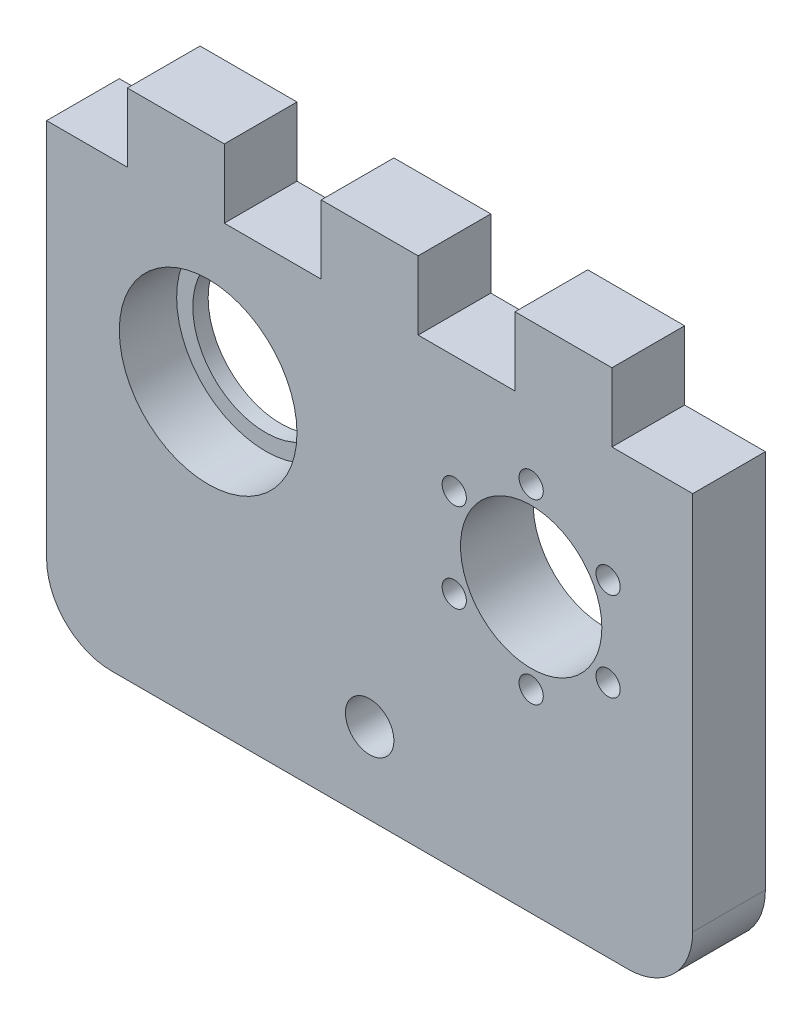
ISO-10303-21;
HEADER;
FILE_DESCRIPTION(('STEP AP214'),'2;1');
FILE_NAME('part.step','',(''),(''),'','','');
FILE_SCHEMA(('AUTOMOTIVE_DESIGN { 1 0 10303 214 1 1 1 1 }'));
ENDSEC;
DATA;
#1=APPLICATION_CONTEXT('core data for automotive mechanical design processes');
#2=APPLICATION_PROTOCOL_DEFINITION('international standard','automotive_design',2000,#1);
#3=PRODUCT_CONTEXT('',#1,'mechanical');
#4=PRODUCT('Part','Part','',(#3));
#5=PRODUCT_RELATED_PRODUCT_CATEGORY('part','',(#4));
#6=PRODUCT_DEFINITION_FORMATION('','',#4);
#7=PRODUCT_DEFINITION_CONTEXT('part definition',#1,'design');
#8=PRODUCT_DEFINITION('design','',#6,#7);
#9=PRODUCT_DEFINITION_SHAPE('','',#8);
#10=(LENGTH_UNIT() NAMED_UNIT(*) SI_UNIT(.MILLI.,.METRE.));
#11=(NAMED_UNIT(*) PLANE_ANGLE_UNIT() SI_UNIT($,.RADIAN.));
#12=(NAMED_UNIT(*) SI_UNIT($,.STERADIAN.) SOLID_ANGLE_UNIT());
#13=UNCERTAINTY_MEASURE_WITH_UNIT(LENGTH_MEASURE(1.E-05),#10,'distance_accuracy_value','');
#14=(GEOMETRIC_REPRESENTATION_CONTEXT(3) GLOBAL_UNCERTAINTY_ASSIGNED_CONTEXT((#13)) GLOBAL_UNIT_ASSIGNED_CONTEXT((#10,
#11,#12)) REPRESENTATION_CONTEXT('',''));
#15=CARTESIAN_POINT('',(0.,0.,0.));
#16=DIRECTION('',(0.,0.,1.));
#17=DIRECTION('',(1.,0.,0.));
#18=AXIS2_PLACEMENT_3D('',#15,#16,#17);
#19=CARTESIAN_POINT('',(0.,55.,9.));
#20=DIRECTION('',(0.,-1.,0.));
#21=DIRECTION('',(0.,0.,-1.));
#22=AXIS2_PLACEMENT_3D('',#19,#20,#21);
#23=PLANE('',#22);
#24=DIRECTION('',(-1.,0.,0.));
#25=VECTOR('',#24,1.);
#26=CARTESIAN_POINT('',(0.,55.,0.));
#27=LINE('',#26,#25);
#28=CARTESIAN_POINT('',(80.,55.,0.));
#29=VERTEX_POINT('',#28);
#30=CARTESIAN_POINT('',(70.,55.,0.));
#31=VERTEX_POINT('',#30);
#32=EDGE_CURVE('E314',#29,#31,#27,.T.);
#33=ORIENTED_EDGE('',*,*,#32,.T.);
#34=DIRECTION('',(0.,0.,1.));
#35=VECTOR('',#34,1.);
#36=CARTESIAN_POINT('',(70.,55.,0.));
#37=LINE('',#36,#35);
#38=CARTESIAN_POINT('',(70.,55.,9.));
#39=VERTEX_POINT('',#38);
#40=EDGE_CURVE('E56',#31,#39,#37,.T.);
#41=ORIENTED_EDGE('',*,*,#40,.T.);
#42=DIRECTION('',(-1.,0.,0.));
#43=VECTOR('',#42,1.);
#44=CARTESIAN_POINT('',(0.,55.,9.));
#45=LINE('',#44,#43);
#46=CARTESIAN_POINT('',(80.,55.,9.));
#47=VERTEX_POINT('',#46);
#48=EDGE_CURVE('E320',#47,#39,#45,.T.);
#49=ORIENTED_EDGE('',*,*,#48,.F.);
#50=DIRECTION('',(0.,0.,-1.));
#51=VECTOR('',#50,1.);
#52=CARTESIAN_POINT('',(80.,55.,9.));
#53=LINE('',#52,#51);
#54=EDGE_CURVE('E337',#47,#29,#53,.T.);
#55=ORIENTED_EDGE('',*,*,#54,.T.);
#56=EDGE_LOOP('',(#33,#41,#49,#55));
#57=FACE_BOUND('',#56,.T.);
#58=ADVANCED_FACE('F33',(#57),#23,.F.);
#59=CARTESIAN_POINT('',(9.99999999999999,55.,9.));
#60=VERTEX_POINT('',#59);
#61=CARTESIAN_POINT('',(0.,55.,9.));
#62=VERTEX_POINT('',#61);
#63=EDGE_CURVE('E319',#60,#62,#45,.T.);
#64=ORIENTED_EDGE('',*,*,#63,.F.);
#65=DIRECTION('',(0.,0.,1.));
#66=VECTOR('',#65,1.);
#67=CARTESIAN_POINT('',(9.99999999999999,55.,0.));
#68=LINE('',#67,#66);
#69=CARTESIAN_POINT('',(9.99999999999999,55.,0.));
#70=VERTEX_POINT('',#69);
#71=EDGE_CURVE('E216',#70,#60,#68,.T.);
#72=ORIENTED_EDGE('',*,*,#71,.F.);
#73=CARTESIAN_POINT('',(0.,55.,0.));
#74=VERTEX_POINT('',#73);
#75=EDGE_CURVE('E331',#70,#74,#27,.T.);
#76=ORIENTED_EDGE('',*,*,#75,.T.);
#77=DIRECTION('',(0.,0.,-1.));
#78=VECTOR('',#77,1.);
#79=CARTESIAN_POINT('',(0.,55.,9.));
#80=LINE('',#79,#78);
#81=EDGE_CURVE('E322',#62,#74,#80,.T.);
#82=ORIENTED_EDGE('',*,*,#81,.F.);
#83=EDGE_LOOP('',(#64,#72,#76,#82));
#84=FACE_BOUND('',#83,.T.);
#85=ADVANCED_FACE('F370',(#84),#23,.F.);
#86=CARTESIAN_POINT('',(34.,55.,0.));
#87=VERTEX_POINT('',#86);
#88=CARTESIAN_POINT('',(22.,55.,0.));
#89=VERTEX_POINT('',#88);
#90=EDGE_CURVE('E334',#87,#89,#27,.T.);
#91=ORIENTED_EDGE('',*,*,#90,.T.);
#92=DIRECTION('',(0.,0.,1.));
#93=VECTOR('',#92,1.);
#94=CARTESIAN_POINT('',(22.,55.,0.));
#95=LINE('',#94,#93);
#96=CARTESIAN_POINT('',(22.,55.,9.));
#97=VERTEX_POINT('',#96);
#98=EDGE_CURVE('E208',#89,#97,#95,.T.);
#99=ORIENTED_EDGE('',*,*,#98,.T.);
#100=CARTESIAN_POINT('',(34.,55.,9.));
#101=VERTEX_POINT('',#100);
#102=EDGE_CURVE('E323',#101,#97,#45,.T.);
#103=ORIENTED_EDGE('',*,*,#102,.F.);
#104=DIRECTION('',(0.,0.,1.));
#105=VECTOR('',#104,1.);
#106=CARTESIAN_POINT('',(34.,55.,0.));
#107=LINE('',#106,#105);
#108=EDGE_CURVE('E247',#87,#101,#107,.T.);
#109=ORIENTED_EDGE('',*,*,#108,.F.);
#110=EDGE_LOOP('',(#91,#99,#103,#109));
#111=FACE_BOUND('',#110,.T.);
#112=ADVANCED_FACE('F401',(#111),#23,.F.);
#113=CARTESIAN_POINT('',(0.,0.,9.));
#114=DIRECTION('',(1.,0.,0.));
#115=DIRECTION('',(0.,0.,-1.));
#116=AXIS2_PLACEMENT_3D('',#113,#114,#115);
#117=PLANE('',#116);
#118=DIRECTION('',(0.,-1.,0.));
#119=VECTOR('',#118,1.);
#120=CARTESIAN_POINT('',(0.,0.,0.));
#121=LINE('',#120,#119);
#122=CARTESIAN_POINT('',(0.,8.,0.));
#123=VERTEX_POINT('',#122);
#124=EDGE_CURVE('E309',#74,#123,#121,.T.);
#125=ORIENTED_EDGE('',*,*,#124,.T.);
#126=DIRECTION('',(0.,0.,-1.));
#127=VECTOR('',#126,1.);
#128=CARTESIAN_POINT('',(0.,8.,9.));
#129=LINE('',#128,#127);
#130=CARTESIAN_POINT('',(0.,8.,9.));
#131=VERTEX_POINT('',#130);
#132=EDGE_CURVE('E349',#123,#131,#129,.F.);
#133=ORIENTED_EDGE('',*,*,#132,.T.);
#134=DIRECTION('',(0.,-1.,0.));
#135=VECTOR('',#134,1.);
#136=CARTESIAN_POINT('',(0.,0.,9.));
#137=LINE('',#136,#135);
#138=EDGE_CURVE('E310',#62,#131,#137,.T.);
#139=ORIENTED_EDGE('',*,*,#138,.F.);
#140=ORIENTED_EDGE('',*,*,#81,.T.);
#141=EDGE_LOOP('',(#125,#133,#139,#140));
#142=FACE_BOUND('',#141,.T.);
#143=ADVANCED_FACE('F367',(#142),#117,.F.);
#144=CARTESIAN_POINT('',(0.,0.,9.));
#145=DIRECTION('',(0.,1.,0.));
#146=DIRECTION('',(0.,0.,1.));
#147=AXIS2_PLACEMENT_3D('',#144,#145,#146);
#148=PLANE('',#147);
#149=DIRECTION('',(1.,0.,0.));
#150=VECTOR('',#149,1.);
#151=CARTESIAN_POINT('',(0.,0.,9.));
#152=LINE('',#151,#150);
#153=CARTESIAN_POINT('',(8.,0.,9.));
#154=VERTEX_POINT('',#153);
#155=CARTESIAN_POINT('',(72.,0.,9.));
#156=VERTEX_POINT('',#155);
#157=EDGE_CURVE('E313',#154,#156,#152,.T.);
#158=ORIENTED_EDGE('',*,*,#157,.F.);
#159=DIRECTION('',(0.,0.,-1.));
#160=VECTOR('',#159,1.);
#161=CARTESIAN_POINT('',(8.,0.,9.));
#162=LINE('',#161,#160);
#163=CARTESIAN_POINT('',(8.,0.,0.));
#164=VERTEX_POINT('',#163);
#165=EDGE_CURVE('E342',#154,#164,#162,.T.);
#166=ORIENTED_EDGE('',*,*,#165,.T.);
#167=DIRECTION('',(1.,0.,0.));
#168=VECTOR('',#167,1.);
#169=CARTESIAN_POINT('',(0.,0.,0.));
#170=LINE('',#169,#168);
#171=CARTESIAN_POINT('',(72.,0.,0.));
#172=VERTEX_POINT('',#171);
#173=EDGE_CURVE('E326',#164,#172,#170,.T.);
#174=ORIENTED_EDGE('',*,*,#173,.T.);
#175=DIRECTION('',(0.,0.,-1.));
#176=VECTOR('',#175,1.);
#177=CARTESIAN_POINT('',(72.,0.,9.));
#178=LINE('',#177,#176);
#179=EDGE_CURVE('E340',#172,#156,#178,.F.);
#180=ORIENTED_EDGE('',*,*,#179,.T.);
#181=EDGE_LOOP('',(#158,#166,#174,#180));
#182=FACE_BOUND('',#181,.T.);
#183=ADVANCED_FACE('F362',(#182),#148,.F.);
#184=CARTESIAN_POINT('',(80.,0.,9.));
#185=DIRECTION('',(-1.,0.,0.));
#186=DIRECTION('',(0.,0.,1.));
#187=AXIS2_PLACEMENT_3D('',#184,#185,#186);
#188=PLANE('',#187);
#189=DIRECTION('',(0.,1.,0.));
#190=VECTOR('',#189,1.);
#191=CARTESIAN_POINT('',(80.,0.,9.));
#192=LINE('',#191,#190);
#193=CARTESIAN_POINT('',(80.,8.,9.));
#194=VERTEX_POINT('',#193);
#195=EDGE_CURVE('E317',#194,#47,#192,.T.);
#196=ORIENTED_EDGE('',*,*,#195,.F.);
#197=DIRECTION('',(0.,0.,-1.));
#198=VECTOR('',#197,1.);
#199=CARTESIAN_POINT('',(80.,8.,9.));
#200=LINE('',#199,#198);
#201=CARTESIAN_POINT('',(80.,8.,0.));
#202=VERTEX_POINT('',#201);
#203=EDGE_CURVE('E11',#194,#202,#200,.T.);
#204=ORIENTED_EDGE('',*,*,#203,.T.);
#205=DIRECTION('',(0.,1.,0.));
#206=VECTOR('',#205,1.);
#207=CARTESIAN_POINT('',(80.,0.,0.));
#208=LINE('',#207,#206);
#209=EDGE_CURVE('E329',#202,#29,#208,.T.);
#210=ORIENTED_EDGE('',*,*,#209,.T.);
#211=ORIENTED_EDGE('',*,*,#54,.F.);
#212=EDGE_LOOP('',(#196,#204,#210,#211));
#213=FACE_BOUND('',#212,.T.);
#214=ADVANCED_FACE('F423',(#213),#188,.F.);
#215=CARTESIAN_POINT('',(58.,55.,9.));
#216=VERTEX_POINT('',#215);
#217=CARTESIAN_POINT('',(46.,55.,9.));
#218=VERTEX_POINT('',#217);
#219=EDGE_CURVE('E48',#216,#218,#45,.T.);
#220=ORIENTED_EDGE('',*,*,#219,.F.);
#221=DIRECTION('',(0.,0.,1.));
#222=VECTOR('',#221,1.);
#223=CARTESIAN_POINT('',(58.,55.,0.));
#224=LINE('',#223,#222);
#225=CARTESIAN_POINT('',(58.,55.,0.));
#226=VERTEX_POINT('',#225);
#227=EDGE_CURVE('E195',#226,#216,#224,.T.);
#228=ORIENTED_EDGE('',*,*,#227,.F.);
#229=CARTESIAN_POINT('',(46.,55.,0.));
#230=VERTEX_POINT('',#229);
#231=EDGE_CURVE('E333',#226,#230,#27,.T.);
#232=ORIENTED_EDGE('',*,*,#231,.T.);
#233=DIRECTION('',(0.,0.,1.));
#234=VECTOR('',#233,1.);
#235=CARTESIAN_POINT('',(46.,55.,0.));
#236=LINE('',#235,#234);
#237=EDGE_CURVE('E245',#230,#218,#236,.T.);
#238=ORIENTED_EDGE('',*,*,#237,.T.);
#239=EDGE_LOOP('',(#220,#228,#232,#238));
#240=FACE_BOUND('',#239,.T.);
#241=ADVANCED_FACE('F374',(#240),#23,.F.);
#242=CARTESIAN_POINT('',(0.,0.,9.));
#243=DIRECTION('',(0.,0.,-1.));
#244=DIRECTION('',(-1.,0.,0.));
#245=AXIS2_PLACEMENT_3D('',#242,#243,#244);
#246=PLANE('',#245);
#247=CARTESIAN_POINT('',(40.,10.,9.));
#248=DIRECTION('',(0.,0.,1.));
#249=DIRECTION('',(1.,0.,0.));
#250=AXIS2_PLACEMENT_3D('',#247,#248,#249);
#251=CIRCLE('',#250,3.00000000000001);
#252=CARTESIAN_POINT('',(43.,10.,9.));
#253=VERTEX_POINT('',#252);
#254=EDGE_CURVE('E258',#253,#253,#251,.T.);
#255=ORIENTED_EDGE('',*,*,#254,.F.);
#256=EDGE_LOOP('',(#255));
#257=FACE_BOUND('',#256,.T.);
#258=CARTESIAN_POINT('',(50.4737205583712,40.5,9.));
#259=DIRECTION('',(0.,0.,1.));
#260=DIRECTION('',(1.,0.,0.));
#261=AXIS2_PLACEMENT_3D('',#258,#259,#260);
#262=CIRCLE('',#261,1.5);
#263=CARTESIAN_POINT('',(51.9737205583712,40.5,9.));
#264=VERTEX_POINT('',#263);
#265=EDGE_CURVE('E262',#264,#264,#262,.T.);
#266=ORIENTED_EDGE('',*,*,#265,.F.);
#267=EDGE_LOOP('',(#266));
#268=FACE_BOUND('',#267,.T.);
#269=CARTESIAN_POINT('',(50.4737205583712,29.5,9.));
#270=DIRECTION('',(0.,0.,1.));
#271=DIRECTION('',(1.,0.,0.));
#272=AXIS2_PLACEMENT_3D('',#269,#270,#271);
#273=CIRCLE('',#272,1.5);
#274=CARTESIAN_POINT('',(51.9737205583712,29.5,9.));
#275=VERTEX_POINT('',#274);
#276=EDGE_CURVE('E281',#275,#275,#273,.T.);
#277=ORIENTED_EDGE('',*,*,#276,.F.);
#278=EDGE_LOOP('',(#277));
#279=FACE_BOUND('',#278,.T.);
#280=CARTESIAN_POINT('',(60.,24.,9.));
#281=DIRECTION('',(0.,0.,1.));
#282=DIRECTION('',(1.,0.,0.));
#283=AXIS2_PLACEMENT_3D('',#280,#281,#282);
#284=CIRCLE('',#283,1.5);
#285=CARTESIAN_POINT('',(61.5,24.,9.));
#286=VERTEX_POINT('',#285);
#287=EDGE_CURVE('E275',#286,#286,#284,.T.);
#288=ORIENTED_EDGE('',*,*,#287,.F.);
#289=EDGE_LOOP('',(#288));
#290=FACE_BOUND('',#289,.T.);
#291=CARTESIAN_POINT('',(69.5262794416288,29.5,9.));
#292=DIRECTION('',(0.,0.,1.));
#293=DIRECTION('',(1.,0.,0.));
#294=AXIS2_PLACEMENT_3D('',#291,#292,#293);
#295=CIRCLE('',#294,1.5);
#296=CARTESIAN_POINT('',(71.0262794416288,29.5,9.));
#297=VERTEX_POINT('',#296);
#298=EDGE_CURVE('E269',#297,#297,#295,.T.);
#299=ORIENTED_EDGE('',*,*,#298,.F.);
#300=EDGE_LOOP('',(#299));
#301=FACE_BOUND('',#300,.T.);
#302=CARTESIAN_POINT('',(60.,35.,9.));
#303=DIRECTION('',(0.,0.,1.));
#304=DIRECTION('',(1.,0.,0.));
#305=AXIS2_PLACEMENT_3D('',#302,#303,#304);
#306=CIRCLE('',#305,8.75000000000001);
#307=CARTESIAN_POINT('',(68.75,35.,9.));
#308=VERTEX_POINT('',#307);
#309=EDGE_CURVE('E292',#308,#308,#306,.T.);
#310=ORIENTED_EDGE('',*,*,#309,.F.);
#311=EDGE_LOOP('',(#310));
#312=FACE_BOUND('',#311,.T.);
#313=CARTESIAN_POINT('',(60.,46.,9.));
#314=DIRECTION('',(0.,0.,1.));
#315=DIRECTION('',(1.,0.,0.));
#316=AXIS2_PLACEMENT_3D('',#313,#314,#315);
#317=CIRCLE('',#316,1.5);
#318=CARTESIAN_POINT('',(61.5,46.,9.));
#319=VERTEX_POINT('',#318);
#320=EDGE_CURVE('E293',#319,#319,#317,.T.);
#321=ORIENTED_EDGE('',*,*,#320,.F.);
#322=EDGE_LOOP('',(#321));
#323=FACE_BOUND('',#322,.T.);
#324=CARTESIAN_POINT('',(69.5262794416288,40.5,9.));
#325=DIRECTION('',(0.,0.,1.));
#326=DIRECTION('',(1.,0.,0.));
#327=AXIS2_PLACEMENT_3D('',#324,#325,#326);
#328=CIRCLE('',#327,1.5);
#329=CARTESIAN_POINT('',(71.0262794416288,40.5,9.));
#330=VERTEX_POINT('',#329);
#331=EDGE_CURVE('E268',#330,#330,#328,.T.);
#332=ORIENTED_EDGE('',*,*,#331,.F.);
#333=EDGE_LOOP('',(#332));
#334=FACE_BOUND('',#333,.T.);
#335=CARTESIAN_POINT('',(20.,37.,9.));
#336=DIRECTION('',(0.,0.,1.));
#337=DIRECTION('',(1.,0.,0.));
#338=AXIS2_PLACEMENT_3D('',#335,#336,#337);
#339=CIRCLE('',#338,11.);
#340=CARTESIAN_POINT('',(31.,37.,9.));
#341=VERTEX_POINT('',#340);
#342=EDGE_CURVE('E304',#341,#341,#339,.T.);
#343=ORIENTED_EDGE('',*,*,#342,.F.);
#344=EDGE_LOOP('',(#343));
#345=FACE_BOUND('',#344,.T.);
#346=ORIENTED_EDGE('',*,*,#138,.T.);
#347=CARTESIAN_POINT('',(8.,8.,9.));
#348=DIRECTION('',(0.,0.,-1.));
#349=DIRECTION('',(-1.,0.,0.));
#350=AXIS2_PLACEMENT_3D('',#347,#348,#349);
#351=CIRCLE('',#350,8.);
#352=EDGE_CURVE('E41',#131,#154,#351,.F.);
#353=ORIENTED_EDGE('',*,*,#352,.T.);
#354=ORIENTED_EDGE('',*,*,#157,.T.);
#355=CARTESIAN_POINT('',(72.,8.,9.));
#356=DIRECTION('',(0.,0.,-1.));
#357=DIRECTION('',(-1.,0.,0.));
#358=AXIS2_PLACEMENT_3D('',#355,#356,#357);
#359=CIRCLE('',#358,8.);
#360=EDGE_CURVE('E351',#156,#194,#359,.F.);
#361=ORIENTED_EDGE('',*,*,#360,.T.);
#362=ORIENTED_EDGE('',*,*,#195,.T.);
#363=ORIENTED_EDGE('',*,*,#48,.T.);
#364=DIRECTION('',(0.,1.,0.));
#365=VECTOR('',#364,1.);
#366=CARTESIAN_POINT('',(70.,55.,9.));
#367=LINE('',#366,#365);
#368=CARTESIAN_POINT('',(70.,63.5,9.));
#369=VERTEX_POINT('',#368);
#370=EDGE_CURVE('E190',#39,#369,#367,.T.);
#371=ORIENTED_EDGE('',*,*,#370,.T.);
#372=DIRECTION('',(-1.,0.,0.));
#373=VECTOR('',#372,1.);
#374=CARTESIAN_POINT('',(58.,63.5,9.));
#375=LINE('',#374,#373);
#376=CARTESIAN_POINT('',(58.,63.5,9.));
#377=VERTEX_POINT('',#376);
#378=EDGE_CURVE('E165',#369,#377,#375,.T.);
#379=ORIENTED_EDGE('',*,*,#378,.T.);
#380=DIRECTION('',(0.,-1.,0.));
#381=VECTOR('',#380,1.);
#382=CARTESIAN_POINT('',(58.,55.,9.));
#383=LINE('',#382,#381);
#384=EDGE_CURVE('E184',#377,#216,#383,.T.);
#385=ORIENTED_EDGE('',*,*,#384,.T.);
#386=ORIENTED_EDGE('',*,*,#219,.T.);
#387=DIRECTION('',(0.,1.,0.));
#388=VECTOR('',#387,1.);
#389=CARTESIAN_POINT('',(46.,55.,9.));
#390=LINE('',#389,#388);
#391=CARTESIAN_POINT('',(46.,63.5,9.));
#392=VERTEX_POINT('',#391);
#393=EDGE_CURVE('E229',#218,#392,#390,.T.);
#394=ORIENTED_EDGE('',*,*,#393,.T.);
#395=DIRECTION('',(-1.,0.,0.));
#396=VECTOR('',#395,1.);
#397=CARTESIAN_POINT('',(34.,63.5,9.));
#398=LINE('',#397,#396);
#399=CARTESIAN_POINT('',(34.,63.5,9.));
#400=VERTEX_POINT('',#399);
#401=EDGE_CURVE('E219',#392,#400,#398,.T.);
#402=ORIENTED_EDGE('',*,*,#401,.T.);
#403=DIRECTION('',(0.,-1.,0.));
#404=VECTOR('',#403,1.);
#405=CARTESIAN_POINT('',(34.,55.,9.));
#406=LINE('',#405,#404);
#407=EDGE_CURVE('E237',#400,#101,#406,.T.);
#408=ORIENTED_EDGE('',*,*,#407,.T.);
#409=ORIENTED_EDGE('',*,*,#102,.T.);
#410=DIRECTION('',(0.,1.,0.));
#411=VECTOR('',#410,1.);
#412=CARTESIAN_POINT('',(22.,55.,9.));
#413=LINE('',#412,#411);
#414=CARTESIAN_POINT('',(22.,63.5,9.));
#415=VERTEX_POINT('',#414);
#416=EDGE_CURVE('E194',#97,#415,#413,.T.);
#417=ORIENTED_EDGE('',*,*,#416,.T.);
#418=DIRECTION('',(-1.,0.,0.));
#419=VECTOR('',#418,1.);
#420=CARTESIAN_POINT('',(22.,63.5,9.));
#421=LINE('',#420,#419);
#422=CARTESIAN_POINT('',(9.99999999999999,63.5,9.));
#423=VERTEX_POINT('',#422);
#424=EDGE_CURVE('E211',#415,#423,#421,.T.);
#425=ORIENTED_EDGE('',*,*,#424,.T.);
#426=DIRECTION('',(0.,-1.,0.));
#427=VECTOR('',#426,1.);
#428=CARTESIAN_POINT('',(9.99999999999999,55.,9.));
#429=LINE('',#428,#427);
#430=EDGE_CURVE('E202',#423,#60,#429,.T.);
#431=ORIENTED_EDGE('',*,*,#430,.T.);
#432=ORIENTED_EDGE('',*,*,#63,.T.);
#433=EDGE_LOOP('',(#346,#353,#354,#361,#362,#363,#371,#379,#385,#386,#394,#402,#408,#409,#417,
#425,#431,#432));
#434=FACE_BOUND('',#433,.T.);
#435=ADVANCED_FACE('F355',(#257,#268,#279,#290,#301,#312,#323,#334,#345,#434),#246,.F.);
#436=CARTESIAN_POINT('',(0.,0.,0.));
#437=DIRECTION('',(0.,0.,-1.));
#438=DIRECTION('',(-1.,0.,0.));
#439=AXIS2_PLACEMENT_3D('',#436,#437,#438);
#440=PLANE('',#439);
#441=CARTESIAN_POINT('',(40.,10.,0.));
#442=DIRECTION('',(0.,0.,1.));
#443=DIRECTION('',(1.,0.,0.));
#444=AXIS2_PLACEMENT_3D('',#441,#442,#443);
#445=CIRCLE('',#444,3.00000000000001);
#446=CARTESIAN_POINT('',(43.,10.,0.));
#447=VERTEX_POINT('',#446);
#448=EDGE_CURVE('E259',#447,#447,#445,.T.);
#449=ORIENTED_EDGE('',*,*,#448,.T.);
#450=EDGE_LOOP('',(#449));
#451=FACE_BOUND('',#450,.T.);
#452=CARTESIAN_POINT('',(50.4737205583712,40.5,0.));
#453=DIRECTION('',(0.,0.,1.));
#454=DIRECTION('',(1.,0.,0.));
#455=AXIS2_PLACEMENT_3D('',#452,#453,#454);
#456=CIRCLE('',#455,1.5);
#457=CARTESIAN_POINT('',(51.9737205583712,40.5,0.));
#458=VERTEX_POINT('',#457);
#459=EDGE_CURVE('E284',#458,#458,#456,.T.);
#460=ORIENTED_EDGE('',*,*,#459,.T.);
#461=EDGE_LOOP('',(#460));
#462=FACE_BOUND('',#461,.T.);
#463=CARTESIAN_POINT('',(50.4737205583712,29.5,0.));
#464=DIRECTION('',(0.,0.,1.));
#465=DIRECTION('',(1.,0.,0.));
#466=AXIS2_PLACEMENT_3D('',#463,#464,#465);
#467=CIRCLE('',#466,1.5);
#468=CARTESIAN_POINT('',(51.9737205583712,29.5,0.));
#469=VERTEX_POINT('',#468);
#470=EDGE_CURVE('E278',#469,#469,#467,.T.);
#471=ORIENTED_EDGE('',*,*,#470,.T.);
#472=EDGE_LOOP('',(#471));
#473=FACE_BOUND('',#472,.T.);
#474=CARTESIAN_POINT('',(60.,24.,0.));
#475=DIRECTION('',(0.,0.,1.));
#476=DIRECTION('',(1.,0.,0.));
#477=AXIS2_PLACEMENT_3D('',#474,#475,#476);
#478=CIRCLE('',#477,1.5);
#479=CARTESIAN_POINT('',(61.5,24.,0.));
#480=VERTEX_POINT('',#479);
#481=EDGE_CURVE('E272',#480,#480,#478,.T.);
#482=ORIENTED_EDGE('',*,*,#481,.T.);
#483=EDGE_LOOP('',(#482));
#484=FACE_BOUND('',#483,.T.);
#485=CARTESIAN_POINT('',(69.5262794416288,29.5,0.));
#486=DIRECTION('',(0.,0.,1.));
#487=DIRECTION('',(1.,0.,0.));
#488=AXIS2_PLACEMENT_3D('',#485,#486,#487);
#489=CIRCLE('',#488,1.5);
#490=CARTESIAN_POINT('',(71.0262794416288,29.5,0.));
#491=VERTEX_POINT('',#490);
#492=EDGE_CURVE('E265',#491,#491,#489,.T.);
#493=ORIENTED_EDGE('',*,*,#492,.T.);
#494=EDGE_LOOP('',(#493));
#495=FACE_BOUND('',#494,.T.);
#496=CARTESIAN_POINT('',(60.,35.,0.));
#497=DIRECTION('',(0.,0.,1.));
#498=DIRECTION('',(1.,0.,0.));
#499=AXIS2_PLACEMENT_3D('',#496,#497,#498);
#500=CIRCLE('',#499,8.75000000000001);
#501=CARTESIAN_POINT('',(68.75,35.,0.));
#502=VERTEX_POINT('',#501);
#503=EDGE_CURVE('E301',#502,#502,#500,.T.);
#504=ORIENTED_EDGE('',*,*,#503,.T.);
#505=EDGE_LOOP('',(#504));
#506=FACE_BOUND('',#505,.T.);
#507=CARTESIAN_POINT('',(60.,46.,0.));
#508=DIRECTION('',(0.,0.,1.));
#509=DIRECTION('',(1.,0.,0.));
#510=AXIS2_PLACEMENT_3D('',#507,#508,#509);
#511=CIRCLE('',#510,1.5);
#512=CARTESIAN_POINT('',(61.5,46.,0.));
#513=VERTEX_POINT('',#512);
#514=EDGE_CURVE('E289',#513,#513,#511,.T.);
#515=ORIENTED_EDGE('',*,*,#514,.T.);
#516=EDGE_LOOP('',(#515));
#517=FACE_BOUND('',#516,.T.);
#518=CARTESIAN_POINT('',(69.5262794416288,40.5,0.));
#519=DIRECTION('',(0.,0.,1.));
#520=DIRECTION('',(1.,0.,0.));
#521=AXIS2_PLACEMENT_3D('',#518,#519,#520);
#522=CIRCLE('',#521,1.5);
#523=CARTESIAN_POINT('',(71.0262794416288,40.5,0.));
#524=VERTEX_POINT('',#523);
#525=EDGE_CURVE('E296',#524,#524,#522,.T.);
#526=ORIENTED_EDGE('',*,*,#525,.T.);
#527=EDGE_LOOP('',(#526));
#528=FACE_BOUND('',#527,.T.);
#529=ORIENTED_EDGE('',*,*,#173,.F.);
#530=CARTESIAN_POINT('',(8.,8.,0.));
#531=DIRECTION('',(0.,0.,-1.));
#532=DIRECTION('',(-1.,0.,0.));
#533=AXIS2_PLACEMENT_3D('',#530,#531,#532);
#534=CIRCLE('',#533,8.);
#535=EDGE_CURVE('E347',#164,#123,#534,.T.);
#536=ORIENTED_EDGE('',*,*,#535,.T.);
#537=ORIENTED_EDGE('',*,*,#124,.F.);
#538=ORIENTED_EDGE('',*,*,#75,.F.);
#539=DIRECTION('',(0.,-1.,0.));
#540=VECTOR('',#539,1.);
#541=CARTESIAN_POINT('',(9.99999999999999,55.,0.));
#542=LINE('',#541,#540);
#543=CARTESIAN_POINT('',(9.99999999999999,63.5,0.));
#544=VERTEX_POINT('',#543);
#545=EDGE_CURVE('E205',#544,#70,#542,.T.);
#546=ORIENTED_EDGE('',*,*,#545,.F.);
#547=DIRECTION('',(-1.,0.,0.));
#548=VECTOR('',#547,1.);
#549=CARTESIAN_POINT('',(22.,63.5,0.));
#550=LINE('',#549,#548);
#551=CARTESIAN_POINT('',(22.,63.5,0.));
#552=VERTEX_POINT('',#551);
#553=EDGE_CURVE('E201',#552,#544,#550,.T.);
#554=ORIENTED_EDGE('',*,*,#553,.F.);
#555=DIRECTION('',(0.,1.,0.));
#556=VECTOR('',#555,1.);
#557=CARTESIAN_POINT('',(22.,55.,0.));
#558=LINE('',#557,#556);
#559=EDGE_CURVE('E198',#89,#552,#558,.T.);
#560=ORIENTED_EDGE('',*,*,#559,.F.);
#561=ORIENTED_EDGE('',*,*,#90,.F.);
#562=DIRECTION('',(0.,-1.,0.));
#563=VECTOR('',#562,1.);
#564=CARTESIAN_POINT('',(34.,55.,0.));
#565=LINE('',#564,#563);
#566=CARTESIAN_POINT('',(34.,63.5,0.));
#567=VERTEX_POINT('',#566);
#568=EDGE_CURVE('E228',#567,#87,#565,.T.);
#569=ORIENTED_EDGE('',*,*,#568,.F.);
#570=DIRECTION('',(-1.,0.,0.));
#571=VECTOR('',#570,1.);
#572=CARTESIAN_POINT('',(34.,63.5,0.));
#573=LINE('',#572,#571);
#574=CARTESIAN_POINT('',(46.,63.5,0.));
#575=VERTEX_POINT('',#574);
#576=EDGE_CURVE('E225',#575,#567,#573,.T.);
#577=ORIENTED_EDGE('',*,*,#576,.F.);
#578=DIRECTION('',(0.,1.,0.));
#579=VECTOR('',#578,1.);
#580=CARTESIAN_POINT('',(46.,55.,0.));
#581=LINE('',#580,#579);
#582=EDGE_CURVE('E231',#230,#575,#581,.T.);
#583=ORIENTED_EDGE('',*,*,#582,.F.);
#584=ORIENTED_EDGE('',*,*,#231,.F.);
#585=DIRECTION('',(0.,-1.,0.));
#586=VECTOR('',#585,1.);
#587=CARTESIAN_POINT('',(58.,55.,0.));
#588=LINE('',#587,#586);
#589=CARTESIAN_POINT('',(58.,63.5,0.));
#590=VERTEX_POINT('',#589);
#591=EDGE_CURVE('E171',#590,#226,#588,.T.);
#592=ORIENTED_EDGE('',*,*,#591,.F.);
#593=DIRECTION('',(-1.,0.,0.));
#594=VECTOR('',#593,1.);
#595=CARTESIAN_POINT('',(58.,63.5,0.));
#596=LINE('',#595,#594);
#597=CARTESIAN_POINT('',(70.,63.5,0.));
#598=VERTEX_POINT('',#597);
#599=EDGE_CURVE('E163',#598,#590,#596,.T.);
#600=ORIENTED_EDGE('',*,*,#599,.F.);
#601=DIRECTION('',(0.,1.,0.));
#602=VECTOR('',#601,1.);
#603=CARTESIAN_POINT('',(70.,55.,0.));
#604=LINE('',#603,#602);
#605=EDGE_CURVE('E180',#31,#598,#604,.T.);
#606=ORIENTED_EDGE('',*,*,#605,.F.);
#607=ORIENTED_EDGE('',*,*,#32,.F.);
#608=ORIENTED_EDGE('',*,*,#209,.F.);
#609=CARTESIAN_POINT('',(72.,8.,0.));
#610=DIRECTION('',(0.,0.,-1.));
#611=DIRECTION('',(-1.,0.,0.));
#612=AXIS2_PLACEMENT_3D('',#609,#610,#611);
#613=CIRCLE('',#612,8.);
#614=EDGE_CURVE('E345',#202,#172,#613,.T.);
#615=ORIENTED_EDGE('',*,*,#614,.T.);
#616=EDGE_LOOP('',(#529,#536,#537,#538,#546,#554,#560,#561,#569,#577,#583,#584,#592,#600,#606,
#607,#608,#615));
#617=FACE_BOUND('',#616,.T.);
#618=CARTESIAN_POINT('',(20.,37.,0.));
#619=DIRECTION('',(0.,0.,1.));
#620=DIRECTION('',(1.,0.,0.));
#621=AXIS2_PLACEMENT_3D('',#618,#619,#620);
#622=CIRCLE('',#621,9.);
#623=CARTESIAN_POINT('',(11.,37.,0.));
#624=VERTEX_POINT('',#623);
#625=EDGE_CURVE('E244',#624,#624,#622,.T.);
#626=ORIENTED_EDGE('',*,*,#625,.T.);
#627=EDGE_LOOP('',(#626));
#628=FACE_BOUND('',#627,.T.);
#629=ADVANCED_FACE('F177',(#451,#462,#473,#484,#495,#506,#517,#528,#617,#628),#440,.T.);
#630=CARTESIAN_POINT('',(20.,37.,0.));
#631=DIRECTION('',(0.,0.,1.));
#632=DIRECTION('',(1.,0.,0.));
#633=AXIS2_PLACEMENT_3D('',#630,#631,#632);
#634=CYLINDRICAL_SURFACE('',#633,11.);
#635=CARTESIAN_POINT('',(20.,37.,1.9));
#636=DIRECTION('',(0.,0.,1.));
#637=DIRECTION('',(1.,0.,0.));
#638=AXIS2_PLACEMENT_3D('',#635,#636,#637);
#639=CIRCLE('',#638,11.);
#640=CARTESIAN_POINT('',(31.,37.,1.9));
#641=VERTEX_POINT('',#640);
#642=EDGE_CURVE('E253',#641,#641,#639,.T.);
#643=ORIENTED_EDGE('',*,*,#642,.F.);
#644=EDGE_LOOP('',(#643));
#645=FACE_BOUND('',#644,.T.);
#646=ORIENTED_EDGE('',*,*,#342,.T.);
#647=EDGE_LOOP('',(#646));
#648=FACE_BOUND('',#647,.T.);
#649=ADVANCED_FACE('F481',(#645,#648),#634,.F.);
#650=CARTESIAN_POINT('',(69.5262794416288,40.5,0.));
#651=DIRECTION('',(0.,0.,1.));
#652=DIRECTION('',(1.,0.,0.));
#653=AXIS2_PLACEMENT_3D('',#650,#651,#652);
#654=CYLINDRICAL_SURFACE('',#653,1.5);
#655=ORIENTED_EDGE('',*,*,#525,.F.);
#656=EDGE_LOOP('',(#655));
#657=FACE_BOUND('',#656,.T.);
#658=ORIENTED_EDGE('',*,*,#331,.T.);
#659=EDGE_LOOP('',(#658));
#660=FACE_BOUND('',#659,.T.);
#661=ADVANCED_FACE('F477',(#657,#660),#654,.F.);
#662=CARTESIAN_POINT('',(60.,46.,0.));
#663=DIRECTION('',(0.,0.,1.));
#664=DIRECTION('',(1.,0.,0.));
#665=AXIS2_PLACEMENT_3D('',#662,#663,#664);
#666=CYLINDRICAL_SURFACE('',#665,1.5);
#667=ORIENTED_EDGE('',*,*,#514,.F.);
#668=EDGE_LOOP('',(#667));
#669=FACE_BOUND('',#668,.T.);
#670=ORIENTED_EDGE('',*,*,#320,.T.);
#671=EDGE_LOOP('',(#670));
#672=FACE_BOUND('',#671,.T.);
#673=ADVANCED_FACE('F474',(#669,#672),#666,.F.);
#674=CARTESIAN_POINT('',(60.,35.,0.));
#675=DIRECTION('',(0.,0.,1.));
#676=DIRECTION('',(1.,0.,0.));
#677=AXIS2_PLACEMENT_3D('',#674,#675,#676);
#678=CYLINDRICAL_SURFACE('',#677,8.75000000000001);
#679=ORIENTED_EDGE('',*,*,#503,.F.);
#680=EDGE_LOOP('',(#679));
#681=FACE_BOUND('',#680,.T.);
#682=ORIENTED_EDGE('',*,*,#309,.T.);
#683=EDGE_LOOP('',(#682));
#684=FACE_BOUND('',#683,.T.);
#685=ADVANCED_FACE('F466',(#681,#684),#678,.F.);
#686=CARTESIAN_POINT('',(69.5262794416288,29.5,0.));
#687=DIRECTION('',(0.,0.,1.));
#688=DIRECTION('',(1.,0.,0.));
#689=AXIS2_PLACEMENT_3D('',#686,#687,#688);
#690=CYLINDRICAL_SURFACE('',#689,1.5);
#691=ORIENTED_EDGE('',*,*,#492,.F.);
#692=EDGE_LOOP('',(#691));
#693=FACE_BOUND('',#692,.T.);
#694=ORIENTED_EDGE('',*,*,#298,.T.);
#695=EDGE_LOOP('',(#694));
#696=FACE_BOUND('',#695,.T.);
#697=ADVANCED_FACE('F462',(#693,#696),#690,.F.);
#698=CARTESIAN_POINT('',(60.,24.,0.));
#699=DIRECTION('',(0.,0.,1.));
#700=DIRECTION('',(1.,0.,0.));
#701=AXIS2_PLACEMENT_3D('',#698,#699,#700);
#702=CYLINDRICAL_SURFACE('',#701,1.5);
#703=ORIENTED_EDGE('',*,*,#481,.F.);
#704=EDGE_LOOP('',(#703));
#705=FACE_BOUND('',#704,.T.);
#706=ORIENTED_EDGE('',*,*,#287,.T.);
#707=EDGE_LOOP('',(#706));
#708=FACE_BOUND('',#707,.T.);
#709=ADVANCED_FACE('F465',(#705,#708),#702,.F.);
#710=CARTESIAN_POINT('',(50.4737205583712,29.5,0.));
#711=DIRECTION('',(0.,0.,1.));
#712=DIRECTION('',(1.,0.,0.));
#713=AXIS2_PLACEMENT_3D('',#710,#711,#712);
#714=CYLINDRICAL_SURFACE('',#713,1.5);
#715=ORIENTED_EDGE('',*,*,#470,.F.);
#716=EDGE_LOOP('',(#715));
#717=FACE_BOUND('',#716,.T.);
#718=ORIENTED_EDGE('',*,*,#276,.T.);
#719=EDGE_LOOP('',(#718));
#720=FACE_BOUND('',#719,.T.);
#721=ADVANCED_FACE('F454',(#717,#720),#714,.F.);
#722=CARTESIAN_POINT('',(50.4737205583712,40.5,0.));
#723=DIRECTION('',(0.,0.,1.));
#724=DIRECTION('',(1.,0.,0.));
#725=AXIS2_PLACEMENT_3D('',#722,#723,#724);
#726=CYLINDRICAL_SURFACE('',#725,1.5);
#727=ORIENTED_EDGE('',*,*,#459,.F.);
#728=EDGE_LOOP('',(#727));
#729=FACE_BOUND('',#728,.T.);
#730=ORIENTED_EDGE('',*,*,#265,.T.);
#731=EDGE_LOOP('',(#730));
#732=FACE_BOUND('',#731,.T.);
#733=ADVANCED_FACE('F448',(#729,#732),#726,.F.);
#734=CARTESIAN_POINT('',(40.,10.,0.));
#735=DIRECTION('',(0.,0.,1.));
#736=DIRECTION('',(1.,0.,0.));
#737=AXIS2_PLACEMENT_3D('',#734,#735,#736);
#738=CYLINDRICAL_SURFACE('',#737,3.00000000000001);
#739=ORIENTED_EDGE('',*,*,#448,.F.);
#740=EDGE_LOOP('',(#739));
#741=FACE_BOUND('',#740,.T.);
#742=ORIENTED_EDGE('',*,*,#254,.T.);
#743=EDGE_LOOP('',(#742));
#744=FACE_BOUND('',#743,.T.);
#745=ADVANCED_FACE('F441',(#741,#744),#738,.F.);
#746=CARTESIAN_POINT('',(8.,8.,9.));
#747=DIRECTION('',(0.,0.,-1.));
#748=DIRECTION('',(-1.,0.,0.));
#749=AXIS2_PLACEMENT_3D('',#746,#747,#748);
#750=CYLINDRICAL_SURFACE('',#749,8.);
#751=ORIENTED_EDGE('',*,*,#352,.F.);
#752=ORIENTED_EDGE('',*,*,#132,.F.);
#753=ORIENTED_EDGE('',*,*,#535,.F.);
#754=ORIENTED_EDGE('',*,*,#165,.F.);
#755=EDGE_LOOP('',(#751,#752,#753,#754));
#756=FACE_BOUND('',#755,.T.);
#757=ADVANCED_FACE('F364',(#756),#750,.T.);
#758=CARTESIAN_POINT('',(72.,8.,9.));
#759=DIRECTION('',(0.,0.,-1.));
#760=DIRECTION('',(-1.,0.,0.));
#761=AXIS2_PLACEMENT_3D('',#758,#759,#760);
#762=CYLINDRICAL_SURFACE('',#761,8.);
#763=ORIENTED_EDGE('',*,*,#360,.F.);
#764=ORIENTED_EDGE('',*,*,#179,.F.);
#765=ORIENTED_EDGE('',*,*,#614,.F.);
#766=ORIENTED_EDGE('',*,*,#203,.F.);
#767=EDGE_LOOP('',(#763,#764,#765,#766));
#768=FACE_BOUND('',#767,.T.);
#769=ADVANCED_FACE('F35',(#768),#762,.T.);
#770=CARTESIAN_POINT('',(20.,37.,1.9));
#771=DIRECTION('',(0.,0.,1.));
#772=DIRECTION('',(1.,0.,0.));
#773=AXIS2_PLACEMENT_3D('',#770,#771,#772);
#774=PLANE('',#773);
#775=ORIENTED_EDGE('',*,*,#642,.T.);
#776=EDGE_LOOP('',(#775));
#777=FACE_BOUND('',#776,.T.);
#778=CARTESIAN_POINT('',(20.,37.,1.9));
#779=DIRECTION('',(0.,0.,1.));
#780=DIRECTION('',(1.,0.,0.));
#781=AXIS2_PLACEMENT_3D('',#778,#779,#780);
#782=CIRCLE('',#781,9.);
#783=CARTESIAN_POINT('',(11.,37.,1.9));
#784=VERTEX_POINT('',#783);
#785=EDGE_CURVE('E250',#784,#784,#782,.T.);
#786=ORIENTED_EDGE('',*,*,#785,.F.);
#787=EDGE_LOOP('',(#786));
#788=FACE_BOUND('',#787,.T.);
#789=ADVANCED_FACE('F446',(#777,#788),#774,.T.);
#790=CARTESIAN_POINT('',(20.,37.,1.9));
#791=DIRECTION('',(0.,0.,-1.));
#792=DIRECTION('',(-1.,0.,0.));
#793=AXIS2_PLACEMENT_3D('',#790,#791,#792);
#794=CYLINDRICAL_SURFACE('',#793,9.);
#795=CARTESIAN_POINT('',(11.,37.,1.9));
#796=CARTESIAN_POINT('',(11.,37.,1.88020833333333));
#797=CARTESIAN_POINT('',(11.,37.,1.86041666666667));
#798=CARTESIAN_POINT('',(11.,37.,1.82083333333333));
#799=CARTESIAN_POINT('',(11.,37.,1.80104166666667));
#800=CARTESIAN_POINT('',(11.,37.,1.76145833333333));
#801=CARTESIAN_POINT('',(11.,37.,1.74166666666667));
#802=CARTESIAN_POINT('',(11.,37.,1.70208333333333));
#803=CARTESIAN_POINT('',(11.,37.,1.68229166666667));
#804=CARTESIAN_POINT('',(11.,37.,1.64270833333333));
#805=CARTESIAN_POINT('',(11.,37.,1.62291666666667));
#806=CARTESIAN_POINT('',(11.,37.,1.58333333333333));
#807=CARTESIAN_POINT('',(11.,37.,1.56354166666667));
#808=CARTESIAN_POINT('',(11.,37.,1.52395833333333));
#809=CARTESIAN_POINT('',(11.,37.,1.50416666666667));
#810=CARTESIAN_POINT('',(11.,37.,1.46458333333333));
#811=CARTESIAN_POINT('',(11.,37.,1.44479166666667));
#812=CARTESIAN_POINT('',(11.,37.,1.40520833333333));
#813=CARTESIAN_POINT('',(11.,37.,1.38541666666667));
#814=CARTESIAN_POINT('',(11.,37.,1.34583333333333));
#815=CARTESIAN_POINT('',(11.,37.,1.32604166666667));
#816=CARTESIAN_POINT('',(11.,37.,1.28645833333333));
#817=CARTESIAN_POINT('',(11.,37.,1.26666666666667));
#818=CARTESIAN_POINT('',(11.,37.,1.22708333333333));
#819=CARTESIAN_POINT('',(11.,37.,1.20729166666667));
#820=CARTESIAN_POINT('',(11.,37.,1.16770833333333));
#821=CARTESIAN_POINT('',(11.,37.,1.14791666666667));
#822=CARTESIAN_POINT('',(11.,37.,1.10833333333333));
#823=CARTESIAN_POINT('',(11.,37.,1.08854166666667));
#824=CARTESIAN_POINT('',(11.,37.,1.04895833333333));
#825=CARTESIAN_POINT('',(11.,37.,1.02916666666667));
#826=CARTESIAN_POINT('',(11.,37.,0.989583333333333));
#827=CARTESIAN_POINT('',(11.,37.,0.969791666666666));
#828=CARTESIAN_POINT('',(11.,37.,0.930208333333333));
#829=CARTESIAN_POINT('',(11.,37.,0.910416666666667));
#830=CARTESIAN_POINT('',(11.,37.,0.870833333333333));
#831=CARTESIAN_POINT('',(11.,37.,0.851041666666667));
#832=CARTESIAN_POINT('',(11.,37.,0.811458333333333));
#833=CARTESIAN_POINT('',(11.,37.,0.791666666666667));
#834=CARTESIAN_POINT('',(11.,37.,0.752083333333333));
#835=CARTESIAN_POINT('',(11.,37.,0.732291666666667));
#836=CARTESIAN_POINT('',(11.,37.,0.692708333333333));
#837=CARTESIAN_POINT('',(11.,37.,0.672916666666667));
#838=CARTESIAN_POINT('',(11.,37.,0.633333333333333));
#839=CARTESIAN_POINT('',(11.,37.,0.613541666666667));
#840=CARTESIAN_POINT('',(11.,37.,0.573958333333333));
#841=CARTESIAN_POINT('',(11.,37.,0.554166666666667));
#842=CARTESIAN_POINT('',(11.,37.,0.514583333333334));
#843=CARTESIAN_POINT('',(11.,37.,0.494791666666667));
#844=CARTESIAN_POINT('',(11.,37.,0.455208333333333));
#845=CARTESIAN_POINT('',(11.,37.,0.435416666666667));
#846=CARTESIAN_POINT('',(11.,37.,0.395833333333333));
#847=CARTESIAN_POINT('',(11.,37.,0.376041666666667));
#848=CARTESIAN_POINT('',(11.,37.,0.336458333333333));
#849=CARTESIAN_POINT('',(11.,37.,0.316666666666667));
#850=CARTESIAN_POINT('',(11.,37.,0.277083333333333));
#851=CARTESIAN_POINT('',(11.,37.,0.257291666666667));
#852=CARTESIAN_POINT('',(11.,37.,0.217708333333333));
#853=CARTESIAN_POINT('',(11.,37.,0.197916666666667));
#854=CARTESIAN_POINT('',(11.,37.,0.158333333333333));
#855=CARTESIAN_POINT('',(11.,37.,0.138541666666667));
#856=CARTESIAN_POINT('',(11.,37.,0.0989583333333333));
#857=CARTESIAN_POINT('',(11.,37.,0.0791666666666666));
#858=CARTESIAN_POINT('',(11.,37.,0.0395833333333333));
#859=CARTESIAN_POINT('',(11.,37.,0.0197916666666666));
#860=CARTESIAN_POINT('',(11.,37.,0.));
#861=B_SPLINE_CURVE_WITH_KNOTS('',3,(#795,#796,#797,#798,#799,#800,#801,#802,#803,#804,#805,
#806,#807,#808,#809,#810,#811,#812,#813,#814,#815,#816,#817,#818,#819,#820,#821,#822,#823,#824,
#825,#826,#827,#828,#829,#830,#831,#832,#833,#834,#835,#836,#837,#838,#839,#840,#841,#842,#843,
#844,#845,#846,#847,#848,#849,#850,#851,#852,#853,#854,#855,#856,#857,#858,#859,#860),
.UNSPECIFIED.,.F.,.F.,(4,2,2,2,2,2,2,2,2,2,2,2,2,2,2,2,2,2,2,2,2,2,2,2,2,2,2,2,2,2,2,2,4),(0.,
0.0593750000000002,0.11875,0.178125,0.2375,0.296875,0.35625,0.415625,0.475,0.534375,0.59375,
0.653125,0.7125,0.771875,0.83125,0.890625,0.95,1.009375,1.06875,1.128125,1.1875,1.246875,
1.30625,1.365625,1.425,1.484375,1.54375,1.603125,1.6625,1.721875,1.78125,1.840625,1.9),.UNSPECIFIED.);
#862=EDGE_CURVE('BSEAM605',#784,#624,#861,.T.);
#863=ORIENTED_EDGE('',*,*,#785,.T.);
#864=ORIENTED_EDGE('',*,*,#625,.F.);
#865=ORIENTED_EDGE('',*,*,#862,.T.);
#866=ORIENTED_EDGE('',*,*,#862,.F.);
#867=EDGE_LOOP('',(#863,#865,#864,#866));
#868=FACE_BOUND('',#867,.T.);
#869=ADVANCED_FACE('F605',(#868),#794,.F.);
#870=CARTESIAN_POINT('',(34.,63.5,0.));
#871=DIRECTION('',(0.,1.,0.));
#872=DIRECTION('',(0.,0.,1.));
#873=AXIS2_PLACEMENT_3D('',#870,#871,#872);
#874=PLANE('',#873);
#875=ORIENTED_EDGE('',*,*,#401,.F.);
#876=DIRECTION('',(0.,0.,1.));
#877=VECTOR('',#876,1.);
#878=CARTESIAN_POINT('',(46.,63.5,0.));
#879=LINE('',#878,#877);
#880=EDGE_CURVE('E242',#575,#392,#879,.T.);
#881=ORIENTED_EDGE('',*,*,#880,.F.);
#882=ORIENTED_EDGE('',*,*,#576,.T.);
#883=DIRECTION('',(0.,0.,1.));
#884=VECTOR('',#883,1.);
#885=CARTESIAN_POINT('',(34.,63.5,0.));
#886=LINE('',#885,#884);
#887=EDGE_CURVE('E234',#567,#400,#886,.T.);
#888=ORIENTED_EDGE('',*,*,#887,.T.);
#889=EDGE_LOOP('',(#875,#881,#882,#888));
#890=FACE_BOUND('',#889,.T.);
#891=ADVANCED_FACE('F384',(#890),#874,.T.);
#892=CARTESIAN_POINT('',(46.,55.,0.));
#893=DIRECTION('',(1.,0.,0.));
#894=DIRECTION('',(0.,0.,-1.));
#895=AXIS2_PLACEMENT_3D('',#892,#893,#894);
#896=PLANE('',#895);
#897=ORIENTED_EDGE('',*,*,#393,.F.);
#898=ORIENTED_EDGE('',*,*,#237,.F.);
#899=ORIENTED_EDGE('',*,*,#582,.T.);
#900=ORIENTED_EDGE('',*,*,#880,.T.);
#901=EDGE_LOOP('',(#897,#898,#899,#900));
#902=FACE_BOUND('',#901,.T.);
#903=ADVANCED_FACE('F378',(#902),#896,.T.);
#904=CARTESIAN_POINT('',(34.,55.,0.));
#905=DIRECTION('',(-1.,0.,0.));
#906=DIRECTION('',(0.,0.,1.));
#907=AXIS2_PLACEMENT_3D('',#904,#905,#906);
#908=PLANE('',#907);
#909=ORIENTED_EDGE('',*,*,#407,.F.);
#910=ORIENTED_EDGE('',*,*,#887,.F.);
#911=ORIENTED_EDGE('',*,*,#568,.T.);
#912=ORIENTED_EDGE('',*,*,#108,.T.);
#913=EDGE_LOOP('',(#909,#910,#911,#912));
#914=FACE_BOUND('',#913,.T.);
#915=ADVANCED_FACE('F404',(#914),#908,.T.);
#916=CARTESIAN_POINT('',(9.99999999999999,55.,0.));
#917=DIRECTION('',(-1.,0.,0.));
#918=DIRECTION('',(0.,0.,1.));
#919=AXIS2_PLACEMENT_3D('',#916,#917,#918);
#920=PLANE('',#919);
#921=ORIENTED_EDGE('',*,*,#430,.F.);
#922=DIRECTION('',(0.,0.,1.));
#923=VECTOR('',#922,1.);
#924=CARTESIAN_POINT('',(9.99999999999999,63.5,0.));
#925=LINE('',#924,#923);
#926=EDGE_CURVE('E220',#544,#423,#925,.T.);
#927=ORIENTED_EDGE('',*,*,#926,.F.);
#928=ORIENTED_EDGE('',*,*,#545,.T.);
#929=ORIENTED_EDGE('',*,*,#71,.T.);
#930=EDGE_LOOP('',(#921,#927,#928,#929));
#931=FACE_BOUND('',#930,.T.);
#932=ADVANCED_FACE('F391',(#931),#920,.T.);
#933=CARTESIAN_POINT('',(22.,63.5,0.));
#934=DIRECTION('',(0.,1.,0.));
#935=DIRECTION('',(0.,0.,1.));
#936=AXIS2_PLACEMENT_3D('',#933,#934,#935);
#937=PLANE('',#936);
#938=ORIENTED_EDGE('',*,*,#424,.F.);
#939=DIRECTION('',(0.,0.,1.));
#940=VECTOR('',#939,1.);
#941=CARTESIAN_POINT('',(22.,63.5,0.));
#942=LINE('',#941,#940);
#943=EDGE_CURVE('E222',#552,#415,#942,.T.);
#944=ORIENTED_EDGE('',*,*,#943,.F.);
#945=ORIENTED_EDGE('',*,*,#553,.T.);
#946=ORIENTED_EDGE('',*,*,#926,.T.);
#947=EDGE_LOOP('',(#938,#944,#945,#946));
#948=FACE_BOUND('',#947,.T.);
#949=ADVANCED_FACE('F411',(#948),#937,.T.);
#950=CARTESIAN_POINT('',(22.,55.,0.));
#951=DIRECTION('',(1.,0.,0.));
#952=DIRECTION('',(0.,1.,0.));
#953=AXIS2_PLACEMENT_3D('',#950,#951,#952);
#954=PLANE('',#953);
#955=ORIENTED_EDGE('',*,*,#416,.F.);
#956=ORIENTED_EDGE('',*,*,#98,.F.);
#957=ORIENTED_EDGE('',*,*,#559,.T.);
#958=ORIENTED_EDGE('',*,*,#943,.T.);
#959=EDGE_LOOP('',(#955,#956,#957,#958));
#960=FACE_BOUND('',#959,.T.);
#961=ADVANCED_FACE('F398',(#960),#954,.T.);
#962=CARTESIAN_POINT('',(70.,55.,0.));
#963=DIRECTION('',(1.,0.,0.));
#964=DIRECTION('',(0.,0.,-1.));
#965=AXIS2_PLACEMENT_3D('',#962,#963,#964);
#966=PLANE('',#965);
#967=ORIENTED_EDGE('',*,*,#370,.F.);
#968=ORIENTED_EDGE('',*,*,#40,.F.);
#969=ORIENTED_EDGE('',*,*,#605,.T.);
#970=DIRECTION('',(0.,0.,1.));
#971=VECTOR('',#970,1.);
#972=CARTESIAN_POINT('',(70.,63.5,0.));
#973=LINE('',#972,#971);
#974=EDGE_CURVE('E160',#598,#369,#973,.T.);
#975=ORIENTED_EDGE('',*,*,#974,.T.);
#976=EDGE_LOOP('',(#967,#968,#969,#975));
#977=FACE_BOUND('',#976,.T.);
#978=ADVANCED_FACE('F183',(#977),#966,.T.);
#979=CARTESIAN_POINT('',(58.,55.,0.));
#980=DIRECTION('',(-1.,0.,0.));
#981=DIRECTION('',(0.,-1.,0.));
#982=AXIS2_PLACEMENT_3D('',#979,#980,#981);
#983=PLANE('',#982);
#984=ORIENTED_EDGE('',*,*,#384,.F.);
#985=DIRECTION('',(0.,0.,1.));
#986=VECTOR('',#985,1.);
#987=CARTESIAN_POINT('',(58.,63.5,0.));
#988=LINE('',#987,#986);
#989=EDGE_CURVE('E170',#590,#377,#988,.T.);
#990=ORIENTED_EDGE('',*,*,#989,.F.);
#991=ORIENTED_EDGE('',*,*,#591,.T.);
#992=ORIENTED_EDGE('',*,*,#227,.T.);
#993=EDGE_LOOP('',(#984,#990,#991,#992));
#994=FACE_BOUND('',#993,.T.);
#995=ADVANCED_FACE('F655',(#994),#983,.T.);
#996=CARTESIAN_POINT('',(58.,63.5,0.));
#997=DIRECTION('',(0.,1.,0.));
#998=DIRECTION('',(0.,0.,1.));
#999=AXIS2_PLACEMENT_3D('',#996,#997,#998);
#1000=PLANE('',#999);
#1001=ORIENTED_EDGE('',*,*,#378,.F.);
#1002=ORIENTED_EDGE('',*,*,#974,.F.);
#1003=ORIENTED_EDGE('',*,*,#599,.T.);
#1004=ORIENTED_EDGE('',*,*,#989,.T.);
#1005=EDGE_LOOP('',(#1001,#1002,#1003,#1004));
#1006=FACE_BOUND('',#1005,.T.);
#1007=ADVANCED_FACE('F162',(#1006),#1000,.T.);
#1008=CLOSED_SHELL('',(#58,#85,#112,#143,#183,#214,#241,#435,#629,#649,#661,#673,#685,#697,#709,
#721,#733,#745,#757,#769,#789,#869,#891,#903,#915,#932,#949,#961,#978,#995,#1007));
#1009=MANIFOLD_SOLID_BREP('B2',#1008);
#1010=ADVANCED_BREP_SHAPE_REPRESENTATION('',(#18,#1009),#14);
#1011=SHAPE_DEFINITION_REPRESENTATION(#9,#1010);
ENDSEC;
END-ISO-10303-21;
